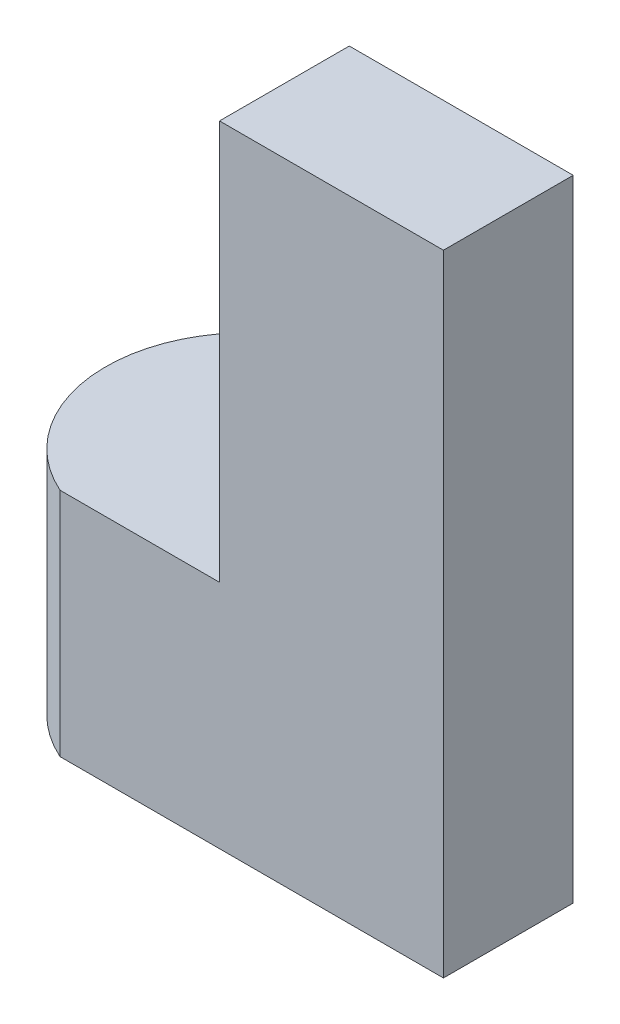
ISO-10303-21;
HEADER;
FILE_DESCRIPTION(('STEP AP214'),'2;1');
FILE_NAME('part.step','',(''),(''),'','','');
FILE_SCHEMA(('AUTOMOTIVE_DESIGN { 1 0 10303 214 1 1 1 1 }'));
ENDSEC;
DATA;
#1=APPLICATION_CONTEXT('core data for automotive mechanical design processes');
#2=APPLICATION_PROTOCOL_DEFINITION('international standard','automotive_design',2000,#1);
#3=PRODUCT_CONTEXT('',#1,'mechanical');
#4=PRODUCT('Part','Part','',(#3));
#5=PRODUCT_RELATED_PRODUCT_CATEGORY('part','',(#4));
#6=PRODUCT_DEFINITION_FORMATION('','',#4);
#7=PRODUCT_DEFINITION_CONTEXT('part definition',#1,'design');
#8=PRODUCT_DEFINITION('design','',#6,#7);
#9=PRODUCT_DEFINITION_SHAPE('','',#8);
#10=(LENGTH_UNIT() NAMED_UNIT(*) SI_UNIT(.MILLI.,.METRE.));
#11=(NAMED_UNIT(*) PLANE_ANGLE_UNIT() SI_UNIT($,.RADIAN.));
#12=(NAMED_UNIT(*) SI_UNIT($,.STERADIAN.) SOLID_ANGLE_UNIT());
#13=UNCERTAINTY_MEASURE_WITH_UNIT(LENGTH_MEASURE(1.E-05),#10,'distance_accuracy_value','');
#14=(GEOMETRIC_REPRESENTATION_CONTEXT(3) GLOBAL_UNCERTAINTY_ASSIGNED_CONTEXT((#13)) GLOBAL_UNIT_ASSIGNED_CONTEXT((#10,
#11,#12)) REPRESENTATION_CONTEXT('',''));
#15=CARTESIAN_POINT('',(0.,0.,0.));
#16=DIRECTION('',(0.,0.,1.));
#17=DIRECTION('',(1.,0.,0.));
#18=AXIS2_PLACEMENT_3D('',#15,#16,#17);
#19=CARTESIAN_POINT('',(38.85095327459,170.,-16.0261324785425));
#20=DIRECTION('',(-1.,0.,0.));
#21=DIRECTION('',(0.,0.,1.));
#22=AXIS2_PLACEMENT_3D('',#19,#20,#21);
#23=PLANE('',#22);
#24=DIRECTION('',(0.,0.,-1.));
#25=VECTOR('',#24,1.);
#26=CARTESIAN_POINT('',(38.85095327459,0.,-16.0261324785425));
#27=LINE('',#26,#25);
#28=CARTESIAN_POINT('',(38.85095327459,0.,18.9738675214575));
#29=VERTEX_POINT('',#28);
#30=CARTESIAN_POINT('',(38.85095327459,0.,-16.0261324785425));
#31=VERTEX_POINT('',#30);
#32=EDGE_CURVE('E96',#29,#31,#27,.T.);
#33=ORIENTED_EDGE('',*,*,#32,.T.);
#34=DIRECTION('',(0.,-1.,0.));
#35=VECTOR('',#34,1.);
#36=CARTESIAN_POINT('',(38.85095327459,170.,-16.0261324785425));
#37=LINE('',#36,#35);
#38=CARTESIAN_POINT('',(38.85095327459,170.,-16.0261324785425));
#39=VERTEX_POINT('',#38);
#40=EDGE_CURVE('E42',#39,#31,#37,.T.);
#41=ORIENTED_EDGE('',*,*,#40,.F.);
#42=DIRECTION('',(0.,0.,-1.));
#43=VECTOR('',#42,1.);
#44=CARTESIAN_POINT('',(38.85095327459,170.,-16.0261324785425));
#45=LINE('',#44,#43);
#46=CARTESIAN_POINT('',(38.85095327459,170.,18.9738675214575));
#47=VERTEX_POINT('',#46);
#48=EDGE_CURVE('E90',#47,#39,#45,.T.);
#49=ORIENTED_EDGE('',*,*,#48,.F.);
#50=DIRECTION('',(0.,-1.,0.));
#51=VECTOR('',#50,1.);
#52=CARTESIAN_POINT('',(38.85095327459,170.,18.9738675214575));
#53=LINE('',#52,#51);
#54=EDGE_CURVE('E81',#47,#29,#53,.T.);
#55=ORIENTED_EDGE('',*,*,#54,.T.);
#56=EDGE_LOOP('',(#33,#41,#49,#55));
#57=FACE_BOUND('',#56,.T.);
#58=ADVANCED_FACE('F35',(#57),#23,.F.);
#59=CARTESIAN_POINT('',(-25.1101855295236,170.,-16.0261324785425));
#60=DIRECTION('',(0.,0.,1.));
#61=DIRECTION('',(1.,0.,0.));
#62=AXIS2_PLACEMENT_3D('',#59,#60,#61);
#63=PLANE('',#62);
#64=DIRECTION('',(1.,0.,0.));
#65=VECTOR('',#64,1.);
#66=CARTESIAN_POINT('',(-25.1101855295236,62.2280341494736,-16.0261324785425));
#67=LINE('',#66,#65);
#68=CARTESIAN_POINT('',(-25.1101855295236,62.2280341494736,-16.0261324785425));
#69=VERTEX_POINT('',#68);
#70=CARTESIAN_POINT('',(-21.5433784580128,62.2280341494736,-16.0261324785425));
#71=VERTEX_POINT('',#70);
#72=EDGE_CURVE('E103',#69,#71,#67,.T.);
#73=ORIENTED_EDGE('',*,*,#72,.T.);
#74=DIRECTION('',(0.,1.,0.));
#75=VECTOR('',#74,1.);
#76=CARTESIAN_POINT('',(-21.5433784580128,170.,-16.0261324785425));
#77=LINE('',#76,#75);
#78=CARTESIAN_POINT('',(-21.5433784580128,170.,-16.0261324785425));
#79=VERTEX_POINT('',#78);
#80=EDGE_CURVE('E128',#71,#79,#77,.T.);
#81=ORIENTED_EDGE('',*,*,#80,.T.);
#82=DIRECTION('',(-1.,0.,0.));
#83=VECTOR('',#82,1.);
#84=CARTESIAN_POINT('',(-25.1101855295236,170.,-16.0261324785425));
#85=LINE('',#84,#83);
#86=EDGE_CURVE('E125',#39,#79,#85,.T.);
#87=ORIENTED_EDGE('',*,*,#86,.F.);
#88=ORIENTED_EDGE('',*,*,#40,.T.);
#89=DIRECTION('',(-1.,0.,0.));
#90=VECTOR('',#89,1.);
#91=CARTESIAN_POINT('',(-25.1101855295236,0.,-16.0261324785425));
#92=LINE('',#91,#90);
#93=CARTESIAN_POINT('',(-25.1101855295236,0.,-16.0261324785425));
#94=VERTEX_POINT('',#93);
#95=EDGE_CURVE('E101',#31,#94,#92,.T.);
#96=ORIENTED_EDGE('',*,*,#95,.T.);
#97=DIRECTION('',(0.,-1.,0.));
#98=VECTOR('',#97,1.);
#99=CARTESIAN_POINT('',(-25.1101855295236,170.,-16.0261324785425));
#100=LINE('',#99,#98);
#101=EDGE_CURVE('E119',#69,#94,#100,.T.);
#102=ORIENTED_EDGE('',*,*,#101,.F.);
#103=EDGE_LOOP('',(#73,#81,#87,#88,#96,#102));
#104=FACE_BOUND('',#103,.T.);
#105=ADVANCED_FACE('F121',(#104),#63,.F.);
#106=CARTESIAN_POINT('',(-25.1101855295236,170.,-46.0792193053076));
#107=DIRECTION('',(-1.,0.,0.));
#108=DIRECTION('',(0.,0.,1.));
#109=AXIS2_PLACEMENT_3D('',#106,#107,#108);
#110=PLANE('',#109);
#111=DIRECTION('',(0.,-1.,0.));
#112=VECTOR('',#111,1.);
#113=CARTESIAN_POINT('',(-25.1101855295236,170.,-46.0792193053076));
#114=LINE('',#113,#112);
#115=CARTESIAN_POINT('',(-25.1101855295236,62.2280341494736,-46.0792193053076));
#116=VERTEX_POINT('',#115);
#117=CARTESIAN_POINT('',(-25.1101855295236,0.,-46.0792193053076));
#118=VERTEX_POINT('',#117);
#119=EDGE_CURVE('E117',#116,#118,#114,.T.);
#120=ORIENTED_EDGE('',*,*,#119,.F.);
#121=DIRECTION('',(0.,0.,1.));
#122=VECTOR('',#121,1.);
#123=CARTESIAN_POINT('',(-25.1101855295236,62.2280341494736,-46.0792193053076));
#124=LINE('',#123,#122);
#125=EDGE_CURVE('E108',#116,#69,#124,.T.);
#126=ORIENTED_EDGE('',*,*,#125,.T.);
#127=ORIENTED_EDGE('',*,*,#101,.T.);
#128=DIRECTION('',(0.,0.,-1.));
#129=VECTOR('',#128,1.);
#130=CARTESIAN_POINT('',(-25.1101855295236,0.,-46.0792193053076));
#131=LINE('',#130,#129);
#132=EDGE_CURVE('E105',#94,#118,#131,.T.);
#133=ORIENTED_EDGE('',*,*,#132,.T.);
#134=EDGE_LOOP('',(#120,#126,#127,#133));
#135=FACE_BOUND('',#134,.T.);
#136=ADVANCED_FACE('F159',(#135),#110,.F.);
#137=CARTESIAN_POINT('',(-48.9150186601681,170.,-16.0261324785425));
#138=DIRECTION('',(0.,-1.,0.));
#139=DIRECTION('',(0.,0.,-1.));
#140=AXIS2_PLACEMENT_3D('',#137,#138,#139);
#141=CYLINDRICAL_SURFACE('',#140,38.3387285677931);
#142=DIRECTION('',(0.,-1.,0.));
#143=VECTOR('',#142,1.);
#144=CARTESIAN_POINT('',(-64.5629612787653,170.,18.9738675214576));
#145=LINE('',#144,#143);
#146=CARTESIAN_POINT('',(-64.5629612787653,62.2280341494736,18.9738675214576));
#147=VERTEX_POINT('',#146);
#148=CARTESIAN_POINT('',(-64.5629612787653,0.,18.9738675214576));
#149=VERTEX_POINT('',#148);
#150=EDGE_CURVE('E85',#147,#149,#145,.T.);
#151=ORIENTED_EDGE('',*,*,#150,.F.);
#152=CARTESIAN_POINT('',(-48.9150186601681,62.2280341494736,-16.0261324785425));
#153=DIRECTION('',(0.,-1.,0.));
#154=DIRECTION('',(0.,0.,-1.));
#155=AXIS2_PLACEMENT_3D('',#152,#153,#154);
#156=CIRCLE('',#155,38.3387285677931);
#157=EDGE_CURVE('E134',#147,#116,#156,.T.);
#158=ORIENTED_EDGE('',*,*,#157,.T.);
#159=ORIENTED_EDGE('',*,*,#119,.T.);
#160=CARTESIAN_POINT('',(-48.9150186601681,0.,-16.0261324785425));
#161=DIRECTION('',(0.,1.,0.));
#162=DIRECTION('',(0.,0.,1.));
#163=AXIS2_PLACEMENT_3D('',#160,#161,#162);
#164=CIRCLE('',#163,38.3387285677931);
#165=EDGE_CURVE('E91',#118,#149,#164,.T.);
#166=ORIENTED_EDGE('',*,*,#165,.T.);
#167=EDGE_LOOP('',(#151,#158,#159,#166));
#168=FACE_BOUND('',#167,.T.);
#169=ADVANCED_FACE('F155',(#168),#141,.T.);
#170=CARTESIAN_POINT('',(38.85095327459,170.,18.9738675214575));
#171=DIRECTION('',(0.,0.,-1.));
#172=DIRECTION('',(-1.,0.,0.));
#173=AXIS2_PLACEMENT_3D('',#170,#171,#172);
#174=PLANE('',#173);
#175=DIRECTION('',(1.,0.,0.));
#176=VECTOR('',#175,1.);
#177=CARTESIAN_POINT('',(38.85095327459,170.,18.9738675214575));
#178=LINE('',#177,#176);
#179=CARTESIAN_POINT('',(-21.5433784580128,170.,18.9738675214576));
#180=VERTEX_POINT('',#179);
#181=EDGE_CURVE('E56',#180,#47,#178,.T.);
#182=ORIENTED_EDGE('',*,*,#181,.F.);
#183=DIRECTION('',(0.,1.,0.));
#184=VECTOR('',#183,1.);
#185=CARTESIAN_POINT('',(-21.5433784580128,201.939657386145,18.9738675214576));
#186=LINE('',#185,#184);
#187=CARTESIAN_POINT('',(-21.5433784580128,62.2280341494736,18.9738675214576));
#188=VERTEX_POINT('',#187);
#189=EDGE_CURVE('E48',#188,#180,#186,.T.);
#190=ORIENTED_EDGE('',*,*,#189,.F.);
#191=DIRECTION('',(1.,0.,0.));
#192=VECTOR('',#191,1.);
#193=CARTESIAN_POINT('',(-87.7915130856905,62.2280341494736,18.9738675214576));
#194=LINE('',#193,#192);
#195=EDGE_CURVE('E141',#147,#188,#194,.T.);
#196=ORIENTED_EDGE('',*,*,#195,.F.);
#197=ORIENTED_EDGE('',*,*,#150,.T.);
#198=DIRECTION('',(1.,0.,0.));
#199=VECTOR('',#198,1.);
#200=CARTESIAN_POINT('',(38.85095327459,0.,18.9738675214575));
#201=LINE('',#200,#199);
#202=EDGE_CURVE('E78',#149,#29,#201,.T.);
#203=ORIENTED_EDGE('',*,*,#202,.T.);
#204=ORIENTED_EDGE('',*,*,#54,.F.);
#205=EDGE_LOOP('',(#182,#190,#196,#197,#203,#204));
#206=FACE_BOUND('',#205,.T.);
#207=ADVANCED_FACE('F80',(#206),#174,.F.);
#208=CARTESIAN_POINT('',(-48.9150186601681,170.,-16.0261324785425));
#209=DIRECTION('',(0.,1.,0.));
#210=DIRECTION('',(0.,0.,1.));
#211=AXIS2_PLACEMENT_3D('',#208,#209,#210);
#212=PLANE('',#211);
#213=DIRECTION('',(0.,0.,-1.));
#214=VECTOR('',#213,1.);
#215=CARTESIAN_POINT('',(-21.5433784580128,170.,-16.0261324785425));
#216=LINE('',#215,#214);
#217=EDGE_CURVE('E11',#180,#79,#216,.T.);
#218=ORIENTED_EDGE('',*,*,#217,.F.);
#219=ORIENTED_EDGE('',*,*,#181,.T.);
#220=ORIENTED_EDGE('',*,*,#48,.T.);
#221=ORIENTED_EDGE('',*,*,#86,.T.);
#222=EDGE_LOOP('',(#218,#219,#220,#221));
#223=FACE_BOUND('',#222,.T.);
#224=ADVANCED_FACE('F129',(#223),#212,.T.);
#225=CARTESIAN_POINT('',(-48.9150186601681,0.,-16.0261324785425));
#226=DIRECTION('',(0.,1.,0.));
#227=DIRECTION('',(0.,0.,1.));
#228=AXIS2_PLACEMENT_3D('',#225,#226,#227);
#229=PLANE('',#228);
#230=ORIENTED_EDGE('',*,*,#32,.F.);
#231=ORIENTED_EDGE('',*,*,#202,.F.);
#232=ORIENTED_EDGE('',*,*,#165,.F.);
#233=ORIENTED_EDGE('',*,*,#132,.F.);
#234=ORIENTED_EDGE('',*,*,#95,.F.);
#235=EDGE_LOOP('',(#230,#231,#232,#233,#234));
#236=FACE_BOUND('',#235,.T.);
#237=ADVANCED_FACE('F98',(#236),#229,.F.);
#238=CARTESIAN_POINT('',(-87.7915130856905,62.2280341494736,-151.026132478542));
#239=DIRECTION('',(0.,-1.,0.));
#240=DIRECTION('',(0.,0.,-1.));
#241=AXIS2_PLACEMENT_3D('',#238,#239,#240);
#242=PLANE('',#241);
#243=ORIENTED_EDGE('',*,*,#125,.F.);
#244=ORIENTED_EDGE('',*,*,#157,.F.);
#245=ORIENTED_EDGE('',*,*,#195,.T.);
#246=DIRECTION('',(0.,0.,1.));
#247=VECTOR('',#246,1.);
#248=CARTESIAN_POINT('',(-21.5433784580128,62.2280341494736,-151.026132478542));
#249=LINE('',#248,#247);
#250=EDGE_CURVE('E138',#71,#188,#249,.T.);
#251=ORIENTED_EDGE('',*,*,#250,.F.);
#252=ORIENTED_EDGE('',*,*,#72,.F.);
#253=EDGE_LOOP('',(#243,#244,#245,#251,#252));
#254=FACE_BOUND('',#253,.T.);
#255=ADVANCED_FACE('F148',(#254),#242,.F.);
#256=CARTESIAN_POINT('',(-21.5433784580128,201.939657386145,-151.026132478542));
#257=DIRECTION('',(1.,0.,0.));
#258=DIRECTION('',(0.,1.,0.));
#259=AXIS2_PLACEMENT_3D('',#256,#257,#258);
#260=PLANE('',#259);
#261=ORIENTED_EDGE('',*,*,#250,.T.);
#262=ORIENTED_EDGE('',*,*,#189,.T.);
#263=ORIENTED_EDGE('',*,*,#217,.T.);
#264=ORIENTED_EDGE('',*,*,#80,.F.);
#265=EDGE_LOOP('',(#261,#262,#263,#264));
#266=FACE_BOUND('',#265,.T.);
#267=ADVANCED_FACE('F163',(#266),#260,.F.);
#268=CLOSED_SHELL('',(#58,#105,#136,#169,#207,#224,#237,#255,#267));
#269=MANIFOLD_SOLID_BREP('B2',#268);
#270=ADVANCED_BREP_SHAPE_REPRESENTATION('',(#18,#269),#14);
#271=SHAPE_DEFINITION_REPRESENTATION(#9,#270);
ENDSEC;
END-ISO-10303-21;
